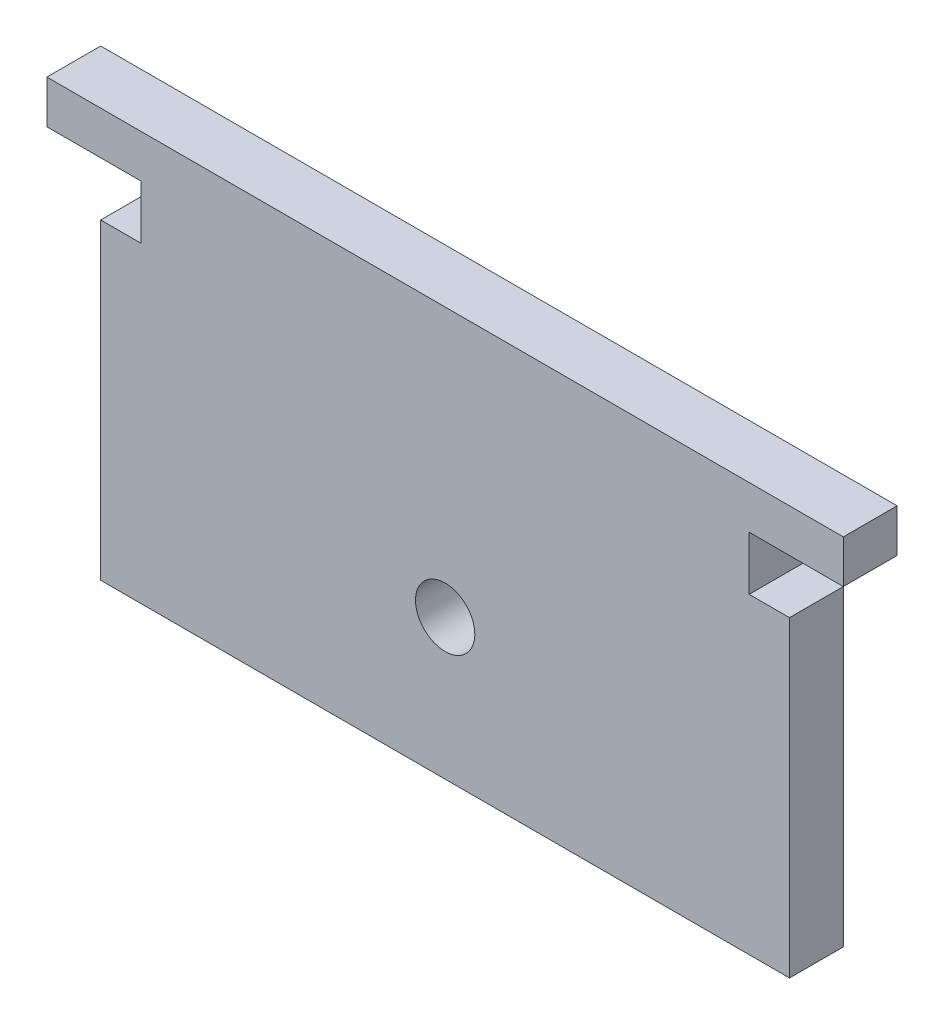
ISO-10303-21;
HEADER;
FILE_DESCRIPTION(('STEP AP214'),'2;1');
FILE_NAME('part.step','',(''),(''),'','','');
FILE_SCHEMA(('AUTOMOTIVE_DESIGN { 1 0 10303 214 1 1 1 1 }'));
ENDSEC;
DATA;
#1=APPLICATION_CONTEXT('core data for automotive mechanical design processes');
#2=APPLICATION_PROTOCOL_DEFINITION('international standard','automotive_design',2000,#1);
#3=PRODUCT_CONTEXT('',#1,'mechanical');
#4=PRODUCT('Part','Part','',(#3));
#5=PRODUCT_RELATED_PRODUCT_CATEGORY('part','',(#4));
#6=PRODUCT_DEFINITION_FORMATION('','',#4);
#7=PRODUCT_DEFINITION_CONTEXT('part definition',#1,'design');
#8=PRODUCT_DEFINITION('design','',#6,#7);
#9=PRODUCT_DEFINITION_SHAPE('','',#8);
#10=(LENGTH_UNIT() NAMED_UNIT(*) SI_UNIT(.MILLI.,.METRE.));
#11=(NAMED_UNIT(*) PLANE_ANGLE_UNIT() SI_UNIT($,.RADIAN.));
#12=(NAMED_UNIT(*) SI_UNIT($,.STERADIAN.) SOLID_ANGLE_UNIT());
#13=UNCERTAINTY_MEASURE_WITH_UNIT(LENGTH_MEASURE(1.E-05),#10,'distance_accuracy_value','');
#14=(GEOMETRIC_REPRESENTATION_CONTEXT(3) GLOBAL_UNCERTAINTY_ASSIGNED_CONTEXT((#13)) GLOBAL_UNIT_ASSIGNED_CONTEXT((#10,
#11,#12)) REPRESENTATION_CONTEXT('',''));
#15=CARTESIAN_POINT('',(0.,0.,0.));
#16=DIRECTION('',(0.,0.,1.));
#17=DIRECTION('',(1.,0.,0.));
#18=AXIS2_PLACEMENT_3D('',#15,#16,#17);
#19=CARTESIAN_POINT('',(0.,0.,6.35));
#20=DIRECTION('',(0.,0.,-1.));
#21=DIRECTION('',(-1.,0.,0.));
#22=AXIS2_PLACEMENT_3D('',#19,#20,#21);
#23=PLANE('',#22);
#24=CARTESIAN_POINT('',(0.00591999999668968,-8.84989999999794,6.35));
#25=DIRECTION('',(0.,0.,1.));
#26=DIRECTION('',(1.,0.,0.));
#27=AXIS2_PLACEMENT_3D('',#24,#25,#26);
#28=CIRCLE('',#27,3.5);
#29=CARTESIAN_POINT('',(3.50591999999669,-8.84989999999794,6.35));
#30=VERTEX_POINT('',#29);
#31=EDGE_CURVE('E166',#30,#30,#28,.T.);
#32=ORIENTED_EDGE('',*,*,#31,.F.);
#33=EDGE_LOOP('',(#32));
#34=FACE_BOUND('',#33,.T.);
#35=DIRECTION('',(1.,0.,0.));
#36=VECTOR('',#35,1.);
#37=CARTESIAN_POINT('',(35.88258,11.43,6.35));
#38=LINE('',#37,#36);
#39=CARTESIAN_POINT('',(35.88258,11.43,6.35));
#40=VERTEX_POINT('',#39);
#41=CARTESIAN_POINT('',(40.64508,11.43,6.35));
#42=VERTEX_POINT('',#41);
#43=EDGE_CURVE('E170',#40,#42,#38,.T.);
#44=ORIENTED_EDGE('',*,*,#43,.F.);
#45=DIRECTION('',(0.,1.,0.));
#46=VECTOR('',#45,1.);
#47=CARTESIAN_POINT('',(35.88258,17.78,6.35));
#48=LINE('',#47,#46);
#49=CARTESIAN_POINT('',(35.88258,17.78,6.35));
#50=VERTEX_POINT('',#49);
#51=EDGE_CURVE('E155',#40,#50,#48,.T.);
#52=ORIENTED_EDGE('',*,*,#51,.T.);
#53=DIRECTION('',(-1.,0.,0.));
#54=VECTOR('',#53,1.);
#55=CARTESIAN_POINT('',(46.99508,17.78,6.35));
#56=LINE('',#55,#54);
#57=CARTESIAN_POINT('',(46.99508,17.78,6.35));
#58=VERTEX_POINT('',#57);
#59=EDGE_CURVE('E151',#58,#50,#56,.T.);
#60=ORIENTED_EDGE('',*,*,#59,.F.);
#61=DIRECTION('',(0.,1.,0.));
#62=VECTOR('',#61,1.);
#63=CARTESIAN_POINT('',(46.99508,-25.4,6.35));
#64=LINE('',#63,#62);
#65=CARTESIAN_POINT('',(46.99508,22.86,6.35));
#66=VERTEX_POINT('',#65);
#67=EDGE_CURVE('E225',#58,#66,#64,.T.);
#68=ORIENTED_EDGE('',*,*,#67,.T.);
#69=DIRECTION('',(1.,0.,0.));
#70=VECTOR('',#69,1.);
#71=CARTESIAN_POINT('',(-46.99508,22.86,6.35));
#72=LINE('',#71,#70);
#73=CARTESIAN_POINT('',(-46.99508,22.86,6.35));
#74=VERTEX_POINT('',#73);
#75=EDGE_CURVE('E195',#74,#66,#72,.T.);
#76=ORIENTED_EDGE('',*,*,#75,.F.);
#77=DIRECTION('',(0.,-1.,0.));
#78=VECTOR('',#77,1.);
#79=CARTESIAN_POINT('',(-46.99508,-25.4,6.35));
#80=LINE('',#79,#78);
#81=CARTESIAN_POINT('',(-46.99508,17.78,6.35));
#82=VERTEX_POINT('',#81);
#83=EDGE_CURVE('E52',#74,#82,#80,.T.);
#84=ORIENTED_EDGE('',*,*,#83,.T.);
#85=DIRECTION('',(-1.,0.,0.));
#86=VECTOR('',#85,1.);
#87=CARTESIAN_POINT('',(-46.99508,17.78,6.35));
#88=LINE('',#87,#86);
#89=CARTESIAN_POINT('',(-35.88258,17.78,6.35));
#90=VERTEX_POINT('',#89);
#91=EDGE_CURVE('E205',#90,#82,#88,.T.);
#92=ORIENTED_EDGE('',*,*,#91,.F.);
#93=DIRECTION('',(0.,1.,0.));
#94=VECTOR('',#93,1.);
#95=CARTESIAN_POINT('',(-35.88258,17.78,6.35));
#96=LINE('',#95,#94);
#97=CARTESIAN_POINT('',(-35.88258,11.43,6.35));
#98=VERTEX_POINT('',#97);
#99=EDGE_CURVE('E182',#98,#90,#96,.T.);
#100=ORIENTED_EDGE('',*,*,#99,.F.);
#101=DIRECTION('',(-1.,0.,0.));
#102=VECTOR('',#101,1.);
#103=CARTESIAN_POINT('',(-35.88258,11.43,6.35));
#104=LINE('',#103,#102);
#105=CARTESIAN_POINT('',(-40.64508,11.43,6.35));
#106=VERTEX_POINT('',#105);
#107=EDGE_CURVE('E189',#98,#106,#104,.T.);
#108=ORIENTED_EDGE('',*,*,#107,.T.);
#109=DIRECTION('',(0.,1.,0.));
#110=VECTOR('',#109,1.);
#111=CARTESIAN_POINT('',(-40.64508,-25.4,6.35));
#112=LINE('',#111,#110);
#113=CARTESIAN_POINT('',(-40.64508,-25.4,6.35));
#114=VERTEX_POINT('',#113);
#115=EDGE_CURVE('E209',#114,#106,#112,.T.);
#116=ORIENTED_EDGE('',*,*,#115,.F.);
#117=DIRECTION('',(1.,0.,0.));
#118=VECTOR('',#117,1.);
#119=CARTESIAN_POINT('',(-46.99508,-25.4,6.35));
#120=LINE('',#119,#118);
#121=CARTESIAN_POINT('',(40.64508,-25.4,6.35));
#122=VERTEX_POINT('',#121);
#123=EDGE_CURVE('E11',#114,#122,#120,.T.);
#124=ORIENTED_EDGE('',*,*,#123,.T.);
#125=DIRECTION('',(0.,-1.,0.));
#126=VECTOR('',#125,1.);
#127=CARTESIAN_POINT('',(40.64508,-25.4,6.35));
#128=LINE('',#127,#126);
#129=EDGE_CURVE('E144',#42,#122,#128,.T.);
#130=ORIENTED_EDGE('',*,*,#129,.F.);
#131=EDGE_LOOP('',(#44,#52,#60,#68,#76,#84,#92,#100,#108,#116,#124,#130));
#132=FACE_BOUND('',#131,.T.);
#133=ADVANCED_FACE('F43',(#34,#132),#23,.F.);
#134=CARTESIAN_POINT('',(0.,0.,0.));
#135=DIRECTION('',(0.,0.,-1.));
#136=DIRECTION('',(-1.,0.,0.));
#137=AXIS2_PLACEMENT_3D('',#134,#135,#136);
#138=PLANE('',#137);
#139=CARTESIAN_POINT('',(0.00591999999668968,-8.84989999999794,0.));
#140=DIRECTION('',(0.,0.,1.));
#141=DIRECTION('',(1.,0.,0.));
#142=AXIS2_PLACEMENT_3D('',#139,#140,#141);
#143=CIRCLE('',#142,3.5);
#144=CARTESIAN_POINT('',(3.50591999999669,-8.84989999999794,0.));
#145=VERTEX_POINT('',#144);
#146=EDGE_CURVE('E163',#145,#145,#143,.T.);
#147=ORIENTED_EDGE('',*,*,#146,.T.);
#148=EDGE_LOOP('',(#147));
#149=FACE_BOUND('',#148,.T.);
#150=DIRECTION('',(0.,-1.,0.));
#151=VECTOR('',#150,1.);
#152=CARTESIAN_POINT('',(35.88258,17.78,0.));
#153=LINE('',#152,#151);
#154=CARTESIAN_POINT('',(35.88258,17.78,0.));
#155=VERTEX_POINT('',#154);
#156=CARTESIAN_POINT('',(35.88258,11.43,0.));
#157=VERTEX_POINT('',#156);
#158=EDGE_CURVE('E139',#155,#157,#153,.T.);
#159=ORIENTED_EDGE('',*,*,#158,.T.);
#160=DIRECTION('',(1.,0.,0.));
#161=VECTOR('',#160,1.);
#162=CARTESIAN_POINT('',(35.88258,11.43,0.));
#163=LINE('',#162,#161);
#164=CARTESIAN_POINT('',(40.64508,11.43,0.));
#165=VERTEX_POINT('',#164);
#166=EDGE_CURVE('E172',#157,#165,#163,.T.);
#167=ORIENTED_EDGE('',*,*,#166,.T.);
#168=DIRECTION('',(0.,-1.,0.));
#169=VECTOR('',#168,1.);
#170=CARTESIAN_POINT('',(40.64508,-25.4,0.));
#171=LINE('',#170,#169);
#172=CARTESIAN_POINT('',(40.64508,-25.4,0.));
#173=VERTEX_POINT('',#172);
#174=EDGE_CURVE('E145',#165,#173,#171,.T.);
#175=ORIENTED_EDGE('',*,*,#174,.T.);
#176=DIRECTION('',(1.,0.,0.));
#177=VECTOR('',#176,1.);
#178=CARTESIAN_POINT('',(-46.99508,-25.4,0.));
#179=LINE('',#178,#177);
#180=CARTESIAN_POINT('',(-40.64508,-25.4,0.));
#181=VERTEX_POINT('',#180);
#182=EDGE_CURVE('E47',#181,#173,#179,.T.);
#183=ORIENTED_EDGE('',*,*,#182,.F.);
#184=DIRECTION('',(0.,1.,0.));
#185=VECTOR('',#184,1.);
#186=CARTESIAN_POINT('',(-40.64508,-25.4,0.));
#187=LINE('',#186,#185);
#188=CARTESIAN_POINT('',(-40.64508,11.43,0.));
#189=VERTEX_POINT('',#188);
#190=EDGE_CURVE('E201',#181,#189,#187,.T.);
#191=ORIENTED_EDGE('',*,*,#190,.T.);
#192=DIRECTION('',(-1.,0.,0.));
#193=VECTOR('',#192,1.);
#194=CARTESIAN_POINT('',(-35.88258,11.43,0.));
#195=LINE('',#194,#193);
#196=CARTESIAN_POINT('',(-35.88258,11.43,0.));
#197=VERTEX_POINT('',#196);
#198=EDGE_CURVE('E60',#197,#189,#195,.T.);
#199=ORIENTED_EDGE('',*,*,#198,.F.);
#200=DIRECTION('',(0.,-1.,0.));
#201=VECTOR('',#200,1.);
#202=CARTESIAN_POINT('',(-35.88258,17.78,0.));
#203=LINE('',#202,#201);
#204=CARTESIAN_POINT('',(-35.88258,17.78,0.));
#205=VERTEX_POINT('',#204);
#206=EDGE_CURVE('E176',#205,#197,#203,.T.);
#207=ORIENTED_EDGE('',*,*,#206,.F.);
#208=DIRECTION('',(-1.,0.,0.));
#209=VECTOR('',#208,1.);
#210=CARTESIAN_POINT('',(-46.99508,17.78,0.));
#211=LINE('',#210,#209);
#212=CARTESIAN_POINT('',(-46.99508,17.78,0.));
#213=VERTEX_POINT('',#212);
#214=EDGE_CURVE('E204',#205,#213,#211,.T.);
#215=ORIENTED_EDGE('',*,*,#214,.T.);
#216=DIRECTION('',(0.,-1.,0.));
#217=VECTOR('',#216,1.);
#218=CARTESIAN_POINT('',(-46.99508,-25.4,0.));
#219=LINE('',#218,#217);
#220=CARTESIAN_POINT('',(-46.99508,22.86,0.));
#221=VERTEX_POINT('',#220);
#222=EDGE_CURVE('E229',#221,#213,#219,.T.);
#223=ORIENTED_EDGE('',*,*,#222,.F.);
#224=DIRECTION('',(-1.,0.,0.));
#225=VECTOR('',#224,1.);
#226=CARTESIAN_POINT('',(-46.99508,22.86,0.));
#227=LINE('',#226,#225);
#228=CARTESIAN_POINT('',(46.99508,22.86,0.));
#229=VERTEX_POINT('',#228);
#230=EDGE_CURVE('E198',#229,#221,#227,.T.);
#231=ORIENTED_EDGE('',*,*,#230,.F.);
#232=DIRECTION('',(0.,1.,0.));
#233=VECTOR('',#232,1.);
#234=CARTESIAN_POINT('',(46.99508,-25.4,0.));
#235=LINE('',#234,#233);
#236=CARTESIAN_POINT('',(46.99508,17.78,0.));
#237=VERTEX_POINT('',#236);
#238=EDGE_CURVE('E141',#237,#229,#235,.T.);
#239=ORIENTED_EDGE('',*,*,#238,.F.);
#240=DIRECTION('',(-1.,0.,0.));
#241=VECTOR('',#240,1.);
#242=CARTESIAN_POINT('',(46.99508,17.78,0.));
#243=LINE('',#242,#241);
#244=EDGE_CURVE('E134',#237,#155,#243,.T.);
#245=ORIENTED_EDGE('',*,*,#244,.T.);
#246=EDGE_LOOP('',(#159,#167,#175,#183,#191,#199,#207,#215,#223,#231,#239,#245));
#247=FACE_BOUND('',#246,.T.);
#248=ADVANCED_FACE('F136',(#149,#247),#138,.T.);
#249=CARTESIAN_POINT('',(40.64508,-25.4,0.));
#250=DIRECTION('',(-1.,0.,0.));
#251=DIRECTION('',(0.,0.,1.));
#252=AXIS2_PLACEMENT_3D('',#249,#250,#251);
#253=PLANE('',#252);
#254=DIRECTION('',(0.,0.,1.));
#255=VECTOR('',#254,1.);
#256=CARTESIAN_POINT('',(40.64508,11.43,0.));
#257=LINE('',#256,#255);
#258=EDGE_CURVE('E160',#165,#42,#257,.T.);
#259=ORIENTED_EDGE('',*,*,#258,.T.);
#260=ORIENTED_EDGE('',*,*,#129,.T.);
#261=DIRECTION('',(0.,0.,1.));
#262=VECTOR('',#261,1.);
#263=CARTESIAN_POINT('',(40.64508,-25.4,0.));
#264=LINE('',#263,#262);
#265=EDGE_CURVE('E200',#173,#122,#264,.T.);
#266=ORIENTED_EDGE('',*,*,#265,.F.);
#267=ORIENTED_EDGE('',*,*,#174,.F.);
#268=EDGE_LOOP('',(#259,#260,#266,#267));
#269=FACE_BOUND('',#268,.T.);
#270=ADVANCED_FACE('F243',(#269),#253,.F.);
#271=CARTESIAN_POINT('',(46.99508,-25.4,6.35));
#272=DIRECTION('',(-1.,0.,0.));
#273=DIRECTION('',(0.,0.,1.));
#274=AXIS2_PLACEMENT_3D('',#271,#272,#273);
#275=PLANE('',#274);
#276=DIRECTION('',(0.,0.,-1.));
#277=VECTOR('',#276,1.);
#278=CARTESIAN_POINT('',(46.99508,22.86,0.));
#279=LINE('',#278,#277);
#280=EDGE_CURVE('E68',#66,#229,#279,.T.);
#281=ORIENTED_EDGE('',*,*,#280,.F.);
#282=ORIENTED_EDGE('',*,*,#67,.F.);
#283=DIRECTION('',(0.,0.,1.));
#284=VECTOR('',#283,1.);
#285=CARTESIAN_POINT('',(46.99508,17.78,0.));
#286=LINE('',#285,#284);
#287=EDGE_CURVE('E218',#237,#58,#286,.T.);
#288=ORIENTED_EDGE('',*,*,#287,.F.);
#289=ORIENTED_EDGE('',*,*,#238,.T.);
#290=EDGE_LOOP('',(#281,#282,#288,#289));
#291=FACE_BOUND('',#290,.T.);
#292=ADVANCED_FACE('F45',(#291),#275,.F.);
#293=CARTESIAN_POINT('',(-46.99508,-25.4,6.35));
#294=DIRECTION('',(1.,0.,0.));
#295=DIRECTION('',(0.,0.,-1.));
#296=AXIS2_PLACEMENT_3D('',#293,#294,#295);
#297=PLANE('',#296);
#298=DIRECTION('',(0.,0.,1.));
#299=VECTOR('',#298,1.);
#300=CARTESIAN_POINT('',(-46.99508,22.86,0.));
#301=LINE('',#300,#299);
#302=EDGE_CURVE('E192',#221,#74,#301,.T.);
#303=ORIENTED_EDGE('',*,*,#302,.F.);
#304=ORIENTED_EDGE('',*,*,#222,.T.);
#305=DIRECTION('',(0.,0.,1.));
#306=VECTOR('',#305,1.);
#307=CARTESIAN_POINT('',(-46.99508,17.78,0.));
#308=LINE('',#307,#306);
#309=EDGE_CURVE('E214',#213,#82,#308,.T.);
#310=ORIENTED_EDGE('',*,*,#309,.T.);
#311=ORIENTED_EDGE('',*,*,#83,.F.);
#312=EDGE_LOOP('',(#303,#304,#310,#311));
#313=FACE_BOUND('',#312,.T.);
#314=ADVANCED_FACE('F260',(#313),#297,.F.);
#315=CARTESIAN_POINT('',(-46.99508,-25.4,6.35));
#316=DIRECTION('',(0.,1.,0.));
#317=DIRECTION('',(0.,0.,1.));
#318=AXIS2_PLACEMENT_3D('',#315,#316,#317);
#319=PLANE('',#318);
#320=ORIENTED_EDGE('',*,*,#123,.F.);
#321=DIRECTION('',(0.,0.,1.));
#322=VECTOR('',#321,1.);
#323=CARTESIAN_POINT('',(-40.64508,-25.4,0.));
#324=LINE('',#323,#322);
#325=EDGE_CURVE('E208',#181,#114,#324,.T.);
#326=ORIENTED_EDGE('',*,*,#325,.F.);
#327=ORIENTED_EDGE('',*,*,#182,.T.);
#328=ORIENTED_EDGE('',*,*,#265,.T.);
#329=EDGE_LOOP('',(#320,#326,#327,#328));
#330=FACE_BOUND('',#329,.T.);
#331=ADVANCED_FACE('F239',(#330),#319,.F.);
#332=CARTESIAN_POINT('',(46.99508,17.78,0.));
#333=DIRECTION('',(0.,1.,0.));
#334=DIRECTION('',(0.,0.,1.));
#335=AXIS2_PLACEMENT_3D('',#332,#333,#334);
#336=PLANE('',#335);
#337=ORIENTED_EDGE('',*,*,#59,.T.);
#338=DIRECTION('',(0.,0.,-1.));
#339=VECTOR('',#338,1.);
#340=CARTESIAN_POINT('',(35.88258,17.78,0.));
#341=LINE('',#340,#339);
#342=EDGE_CURVE('E148',#50,#155,#341,.T.);
#343=ORIENTED_EDGE('',*,*,#342,.T.);
#344=ORIENTED_EDGE('',*,*,#244,.F.);
#345=ORIENTED_EDGE('',*,*,#287,.T.);
#346=EDGE_LOOP('',(#337,#343,#344,#345));
#347=FACE_BOUND('',#346,.T.);
#348=ADVANCED_FACE('F149',(#347),#336,.F.);
#349=CARTESIAN_POINT('',(-46.99508,17.78,0.));
#350=DIRECTION('',(0.,1.,0.));
#351=DIRECTION('',(0.,0.,1.));
#352=AXIS2_PLACEMENT_3D('',#349,#350,#351);
#353=PLANE('',#352);
#354=ORIENTED_EDGE('',*,*,#91,.T.);
#355=ORIENTED_EDGE('',*,*,#309,.F.);
#356=ORIENTED_EDGE('',*,*,#214,.F.);
#357=DIRECTION('',(0.,0.,-1.));
#358=VECTOR('',#357,1.);
#359=CARTESIAN_POINT('',(-35.88258,17.78,0.));
#360=LINE('',#359,#358);
#361=EDGE_CURVE('E185',#90,#205,#360,.T.);
#362=ORIENTED_EDGE('',*,*,#361,.F.);
#363=EDGE_LOOP('',(#354,#355,#356,#362));
#364=FACE_BOUND('',#363,.T.);
#365=ADVANCED_FACE('F259',(#364),#353,.F.);
#366=CARTESIAN_POINT('',(-40.64508,-25.4,0.));
#367=DIRECTION('',(1.,0.,0.));
#368=DIRECTION('',(0.,0.,-1.));
#369=AXIS2_PLACEMENT_3D('',#366,#367,#368);
#370=PLANE('',#369);
#371=ORIENTED_EDGE('',*,*,#115,.T.);
#372=DIRECTION('',(0.,0.,1.));
#373=VECTOR('',#372,1.);
#374=CARTESIAN_POINT('',(-40.64508,11.43,0.));
#375=LINE('',#374,#373);
#376=EDGE_CURVE('E174',#189,#106,#375,.T.);
#377=ORIENTED_EDGE('',*,*,#376,.F.);
#378=ORIENTED_EDGE('',*,*,#190,.F.);
#379=ORIENTED_EDGE('',*,*,#325,.T.);
#380=EDGE_LOOP('',(#371,#377,#378,#379));
#381=FACE_BOUND('',#380,.T.);
#382=ADVANCED_FACE('F250',(#381),#370,.F.);
#383=CARTESIAN_POINT('',(0.,22.86,0.));
#384=DIRECTION('',(0.,1.,0.));
#385=DIRECTION('',(0.,0.,1.));
#386=AXIS2_PLACEMENT_3D('',#383,#384,#385);
#387=PLANE('',#386);
#388=ORIENTED_EDGE('',*,*,#302,.T.);
#389=ORIENTED_EDGE('',*,*,#75,.T.);
#390=ORIENTED_EDGE('',*,*,#280,.T.);
#391=ORIENTED_EDGE('',*,*,#230,.T.);
#392=EDGE_LOOP('',(#388,#389,#390,#391));
#393=FACE_BOUND('',#392,.T.);
#394=ADVANCED_FACE('F263',(#393),#387,.T.);
#395=CARTESIAN_POINT('',(-35.88258,11.43,0.));
#396=DIRECTION('',(0.,-1.,0.));
#397=DIRECTION('',(0.,0.,-1.));
#398=AXIS2_PLACEMENT_3D('',#395,#396,#397);
#399=PLANE('',#398);
#400=ORIENTED_EDGE('',*,*,#376,.T.);
#401=ORIENTED_EDGE('',*,*,#107,.F.);
#402=DIRECTION('',(0.,0.,1.));
#403=VECTOR('',#402,1.);
#404=CARTESIAN_POINT('',(-35.88258,11.43,0.));
#405=LINE('',#404,#403);
#406=EDGE_CURVE('E179',#197,#98,#405,.T.);
#407=ORIENTED_EDGE('',*,*,#406,.F.);
#408=ORIENTED_EDGE('',*,*,#198,.T.);
#409=EDGE_LOOP('',(#400,#401,#407,#408));
#410=FACE_BOUND('',#409,.T.);
#411=ADVANCED_FACE('F251',(#410),#399,.F.);
#412=CARTESIAN_POINT('',(-35.88258,0.,0.));
#413=DIRECTION('',(-1.,0.,0.));
#414=DIRECTION('',(0.,0.,1.));
#415=AXIS2_PLACEMENT_3D('',#412,#413,#414);
#416=PLANE('',#415);
#417=ORIENTED_EDGE('',*,*,#206,.T.);
#418=ORIENTED_EDGE('',*,*,#406,.T.);
#419=ORIENTED_EDGE('',*,*,#99,.T.);
#420=ORIENTED_EDGE('',*,*,#361,.T.);
#421=EDGE_LOOP('',(#417,#418,#419,#420));
#422=FACE_BOUND('',#421,.T.);
#423=ADVANCED_FACE('F253',(#422),#416,.T.);
#424=CARTESIAN_POINT('',(35.88258,11.43,0.));
#425=DIRECTION('',(0.,1.,0.));
#426=DIRECTION('',(0.,0.,1.));
#427=AXIS2_PLACEMENT_3D('',#424,#425,#426);
#428=PLANE('',#427);
#429=ORIENTED_EDGE('',*,*,#258,.F.);
#430=ORIENTED_EDGE('',*,*,#166,.F.);
#431=DIRECTION('',(0.,0.,1.));
#432=VECTOR('',#431,1.);
#433=CARTESIAN_POINT('',(35.88258,11.43,0.));
#434=LINE('',#433,#432);
#435=EDGE_CURVE('E158',#157,#40,#434,.T.);
#436=ORIENTED_EDGE('',*,*,#435,.T.);
#437=ORIENTED_EDGE('',*,*,#43,.T.);
#438=EDGE_LOOP('',(#429,#430,#436,#437));
#439=FACE_BOUND('',#438,.T.);
#440=ADVANCED_FACE('F312',(#439),#428,.T.);
#441=CARTESIAN_POINT('',(35.88258,0.,0.));
#442=DIRECTION('',(1.,0.,0.));
#443=DIRECTION('',(0.,0.,1.));
#444=AXIS2_PLACEMENT_3D('',#441,#442,#443);
#445=PLANE('',#444);
#446=ORIENTED_EDGE('',*,*,#158,.F.);
#447=ORIENTED_EDGE('',*,*,#342,.F.);
#448=ORIENTED_EDGE('',*,*,#51,.F.);
#449=ORIENTED_EDGE('',*,*,#435,.F.);
#450=EDGE_LOOP('',(#446,#447,#448,#449));
#451=FACE_BOUND('',#450,.T.);
#452=ADVANCED_FACE('F157',(#451),#445,.T.);
#453=CARTESIAN_POINT('',(0.00591999999668968,-8.84989999999794,0.));
#454=DIRECTION('',(0.,0.,1.));
#455=DIRECTION('',(1.,0.,0.));
#456=AXIS2_PLACEMENT_3D('',#453,#454,#455);
#457=CYLINDRICAL_SURFACE('',#456,3.5);
#458=ORIENTED_EDGE('',*,*,#146,.F.);
#459=EDGE_LOOP('',(#458));
#460=FACE_BOUND('',#459,.T.);
#461=ORIENTED_EDGE('',*,*,#31,.T.);
#462=EDGE_LOOP('',(#461));
#463=FACE_BOUND('',#462,.T.);
#464=ADVANCED_FACE('F321',(#460,#463),#457,.F.);
#465=CLOSED_SHELL('',(#133,#248,#270,#292,#314,#331,#348,#365,#382,#394,#411,#423,#440,#452,#464));
#466=MANIFOLD_SOLID_BREP('B2',#465);
#467=ADVANCED_BREP_SHAPE_REPRESENTATION('',(#18,#466),#14);
#468=SHAPE_DEFINITION_REPRESENTATION(#9,#467);
ENDSEC;
END-ISO-10303-21;
